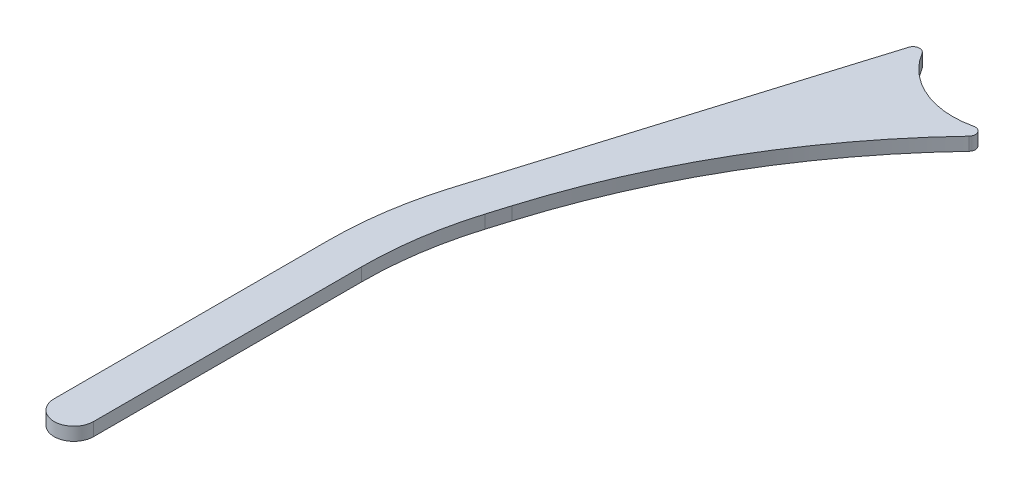
ISO-10303-21;
HEADER;
FILE_DESCRIPTION(('STEP AP214'),'2;1');
FILE_NAME('part.step','',(''),(''),'','','');
FILE_SCHEMA(('AUTOMOTIVE_DESIGN { 1 0 10303 214 1 1 1 1 }'));
ENDSEC;
DATA;
#1=APPLICATION_CONTEXT('core data for automotive mechanical design processes');
#2=APPLICATION_PROTOCOL_DEFINITION('international standard','automotive_design',2000,#1);
#3=PRODUCT_CONTEXT('',#1,'mechanical');
#4=PRODUCT('Part','Part','',(#3));
#5=PRODUCT_RELATED_PRODUCT_CATEGORY('part','',(#4));
#6=PRODUCT_DEFINITION_FORMATION('','',#4);
#7=PRODUCT_DEFINITION_CONTEXT('part definition',#1,'design');
#8=PRODUCT_DEFINITION('design','',#6,#7);
#9=PRODUCT_DEFINITION_SHAPE('','',#8);
#10=(LENGTH_UNIT() NAMED_UNIT(*) SI_UNIT(.MILLI.,.METRE.));
#11=(NAMED_UNIT(*) PLANE_ANGLE_UNIT() SI_UNIT($,.RADIAN.));
#12=(NAMED_UNIT(*) SI_UNIT($,.STERADIAN.) SOLID_ANGLE_UNIT());
#13=UNCERTAINTY_MEASURE_WITH_UNIT(LENGTH_MEASURE(1.E-05),#10,'distance_accuracy_value','');
#14=(GEOMETRIC_REPRESENTATION_CONTEXT(3) GLOBAL_UNCERTAINTY_ASSIGNED_CONTEXT((#13)) GLOBAL_UNIT_ASSIGNED_CONTEXT((#10,
#11,#12)) REPRESENTATION_CONTEXT('',''));
#15=CARTESIAN_POINT('',(0.,0.,0.));
#16=DIRECTION('',(0.,0.,1.));
#17=DIRECTION('',(1.,0.,0.));
#18=AXIS2_PLACEMENT_3D('',#15,#16,#17);
#19=CARTESIAN_POINT('',(-89.4955830872352,6.35,374.65));
#20=DIRECTION('',(0.,-1.,0.));
#21=DIRECTION('',(0.,0.,-1.));
#22=AXIS2_PLACEMENT_3D('',#19,#20,#21);
#23=CYLINDRICAL_SURFACE('',#22,9.52500000000001);
#24=CARTESIAN_POINT('',(-89.4955830872352,0.,374.65));
#25=DIRECTION('',(0.,1.,0.));
#26=DIRECTION('',(0.,0.,-1.));
#27=AXIS2_PLACEMENT_3D('',#24,#25,#26);
#28=CIRCLE('',#27,9.52500000000001);
#29=CARTESIAN_POINT('',(-99.0205830872352,0.,374.65));
#30=VERTEX_POINT('',#29);
#31=CARTESIAN_POINT('',(-79.9705830872352,0.,374.65));
#32=VERTEX_POINT('',#31);
#33=EDGE_CURVE('E146',#30,#32,#28,.T.);
#34=ORIENTED_EDGE('',*,*,#33,.T.);
#35=DIRECTION('',(0.,-1.,0.));
#36=VECTOR('',#35,1.);
#37=CARTESIAN_POINT('',(-79.9705830872352,6.35,374.65));
#38=LINE('',#37,#36);
#39=CARTESIAN_POINT('',(-79.9705830872352,6.35,374.65));
#40=VERTEX_POINT('',#39);
#41=EDGE_CURVE('E11',#40,#32,#38,.T.);
#42=ORIENTED_EDGE('',*,*,#41,.F.);
#43=CARTESIAN_POINT('',(-89.4955830872352,6.35,374.65));
#44=DIRECTION('',(0.,1.,0.));
#45=DIRECTION('',(0.,0.,-1.));
#46=AXIS2_PLACEMENT_3D('',#43,#44,#45);
#47=CIRCLE('',#46,9.52500000000001);
#48=CARTESIAN_POINT('',(-99.0205830872352,6.35,374.65));
#49=VERTEX_POINT('',#48);
#50=EDGE_CURVE('E166',#49,#40,#47,.T.);
#51=ORIENTED_EDGE('',*,*,#50,.F.);
#52=DIRECTION('',(0.,-1.,0.));
#53=VECTOR('',#52,1.);
#54=CARTESIAN_POINT('',(-99.0205830872352,6.35,374.65));
#55=LINE('',#54,#53);
#56=EDGE_CURVE('E142',#49,#30,#55,.T.);
#57=ORIENTED_EDGE('',*,*,#56,.T.);
#58=EDGE_LOOP('',(#34,#42,#51,#57));
#59=FACE_BOUND('',#58,.T.);
#60=ADVANCED_FACE('F32',(#59),#23,.T.);
#61=CARTESIAN_POINT('',(-79.9705830872352,6.35,245.266880287831));
#62=DIRECTION('',(-1.,0.,0.));
#63=DIRECTION('',(0.,0.,1.));
#64=AXIS2_PLACEMENT_3D('',#61,#62,#63);
#65=PLANE('',#64);
#66=DIRECTION('',(0.,0.,-1.));
#67=VECTOR('',#66,1.);
#68=CARTESIAN_POINT('',(-79.9705830872352,0.,245.266880287831));
#69=LINE('',#68,#67);
#70=CARTESIAN_POINT('',(-79.9705830872352,0.,245.266880287831));
#71=VERTEX_POINT('',#70);
#72=EDGE_CURVE('E149',#32,#71,#69,.T.);
#73=ORIENTED_EDGE('',*,*,#72,.T.);
#74=DIRECTION('',(0.,-1.,0.));
#75=VECTOR('',#74,1.);
#76=CARTESIAN_POINT('',(-79.9705830872352,6.35,245.266880287831));
#77=LINE('',#76,#75);
#78=CARTESIAN_POINT('',(-79.9705830872352,6.35,245.266880287831));
#79=VERTEX_POINT('',#78);
#80=EDGE_CURVE('E40',#79,#71,#77,.T.);
#81=ORIENTED_EDGE('',*,*,#80,.F.);
#82=DIRECTION('',(0.,0.,-1.));
#83=VECTOR('',#82,1.);
#84=CARTESIAN_POINT('',(-79.9705830872352,6.35,245.266880287831));
#85=LINE('',#84,#83);
#86=EDGE_CURVE('E100',#40,#79,#85,.T.);
#87=ORIENTED_EDGE('',*,*,#86,.F.);
#88=ORIENTED_EDGE('',*,*,#41,.T.);
#89=EDGE_LOOP('',(#73,#81,#87,#88));
#90=FACE_BOUND('',#89,.T.);
#91=ADVANCED_FACE('F238',(#90),#65,.F.);
#92=CARTESIAN_POINT('',(97.8294169127646,6.35,245.266880287832));
#93=DIRECTION('',(0.,-1.,0.));
#94=DIRECTION('',(0.,0.,-1.));
#95=AXIS2_PLACEMENT_3D('',#92,#93,#94);
#96=CYLINDRICAL_SURFACE('',#95,177.8);
#97=CARTESIAN_POINT('',(97.8294169127646,0.,245.266880287832));
#98=DIRECTION('',(0.,-1.,0.));
#99=DIRECTION('',(0.,0.,1.));
#100=AXIS2_PLACEMENT_3D('',#97,#98,#99);
#101=CIRCLE('',#100,177.8);
#102=CARTESIAN_POINT('',(-72.2428551354819,0.,193.418425341255));
#103=VERTEX_POINT('',#102);
#104=EDGE_CURVE('E151',#71,#103,#101,.T.);
#105=ORIENTED_EDGE('',*,*,#104,.T.);
#106=DIRECTION('',(0.,-1.,0.));
#107=VECTOR('',#106,1.);
#108=CARTESIAN_POINT('',(-72.2428551354819,6.35,193.418425341255));
#109=LINE('',#108,#107);
#110=CARTESIAN_POINT('',(-72.2428551354819,6.35,193.418425341255));
#111=VERTEX_POINT('',#110);
#112=EDGE_CURVE('E182',#111,#103,#109,.T.);
#113=ORIENTED_EDGE('',*,*,#112,.F.);
#114=CARTESIAN_POINT('',(97.8294169127646,6.35,245.266880287832));
#115=DIRECTION('',(0.,-1.,0.));
#116=DIRECTION('',(0.,0.,1.));
#117=AXIS2_PLACEMENT_3D('',#114,#115,#116);
#118=CIRCLE('',#117,177.8);
#119=EDGE_CURVE('E190',#79,#111,#118,.T.);
#120=ORIENTED_EDGE('',*,*,#119,.F.);
#121=ORIENTED_EDGE('',*,*,#80,.T.);
#122=EDGE_LOOP('',(#105,#113,#120,#121));
#123=FACE_BOUND('',#122,.T.);
#124=ADVANCED_FACE('F188',(#123),#96,.F.);
#125=CARTESIAN_POINT('',(-69.161727013274,6.35,183.311770075335));
#126=DIRECTION('',(-0.956536963150994,0.,-0.291611107686032));
#127=DIRECTION('',(-0.291611107686032,0.,0.956536963150994));
#128=AXIS2_PLACEMENT_3D('',#125,#126,#127);
#129=PLANE('',#128);
#130=DIRECTION('',(0.291611107686032,0.,-0.956536963150994));
#131=VECTOR('',#130,1.);
#132=CARTESIAN_POINT('',(-69.161727013274,0.,183.311770075335));
#133=LINE('',#132,#131);
#134=CARTESIAN_POINT('',(-69.161727013274,0.,183.311770075335));
#135=VERTEX_POINT('',#134);
#136=EDGE_CURVE('E153',#103,#135,#133,.T.);
#137=ORIENTED_EDGE('',*,*,#136,.T.);
#138=DIRECTION('',(0.,-1.,0.));
#139=VECTOR('',#138,1.);
#140=CARTESIAN_POINT('',(-69.161727013274,6.35,183.311770075335));
#141=LINE('',#140,#139);
#142=CARTESIAN_POINT('',(-69.161727013274,6.35,183.311770075335));
#143=VERTEX_POINT('',#142);
#144=EDGE_CURVE('E179',#143,#135,#141,.T.);
#145=ORIENTED_EDGE('',*,*,#144,.F.);
#146=DIRECTION('',(0.291611107686032,0.,-0.956536963150994));
#147=VECTOR('',#146,1.);
#148=CARTESIAN_POINT('',(-69.161727013274,6.35,183.311770075335));
#149=LINE('',#148,#147);
#150=EDGE_CURVE('E208',#111,#143,#149,.T.);
#151=ORIENTED_EDGE('',*,*,#150,.F.);
#152=ORIENTED_EDGE('',*,*,#112,.T.);
#153=EDGE_LOOP('',(#137,#145,#151,#152));
#154=FACE_BOUND('',#153,.T.);
#155=ADVANCED_FACE('F199',(#154),#129,.F.);
#156=CARTESIAN_POINT('',(266.906174547564,6.35,285.765869401558));
#157=DIRECTION('',(0.,-1.,0.));
#158=DIRECTION('',(0.,0.,-1.));
#159=AXIS2_PLACEMENT_3D('',#156,#157,#158);
#160=CYLINDRICAL_SURFACE('',#159,351.338123363026);
#161=CARTESIAN_POINT('',(266.906174547564,0.,285.765869401558));
#162=DIRECTION('',(0.,-1.,0.));
#163=DIRECTION('',(0.,0.,-1.));
#164=AXIS2_PLACEMENT_3D('',#161,#162,#163);
#165=CIRCLE('',#164,351.338123363026);
#166=CARTESIAN_POINT('',(12.0504296123994,0.,43.924958466714));
#167=VERTEX_POINT('',#166);
#168=EDGE_CURVE('E155',#135,#167,#165,.T.);
#169=ORIENTED_EDGE('',*,*,#168,.T.);
#170=DIRECTION('',(0.,-1.,0.));
#171=VECTOR('',#170,1.);
#172=CARTESIAN_POINT('',(12.0504296123994,6.35,43.924958466714));
#173=LINE('',#172,#171);
#174=CARTESIAN_POINT('',(12.0504296123994,6.35,43.924958466714));
#175=VERTEX_POINT('',#174);
#176=EDGE_CURVE('E176',#175,#167,#173,.T.);
#177=ORIENTED_EDGE('',*,*,#176,.F.);
#178=CARTESIAN_POINT('',(266.906174547564,6.35,285.765869401558));
#179=DIRECTION('',(0.,-1.,0.));
#180=DIRECTION('',(0.,0.,-1.));
#181=AXIS2_PLACEMENT_3D('',#178,#179,#180);
#182=CIRCLE('',#181,351.338123363026);
#183=EDGE_CURVE('E205',#143,#175,#182,.T.);
#184=ORIENTED_EDGE('',*,*,#183,.F.);
#185=ORIENTED_EDGE('',*,*,#144,.T.);
#186=EDGE_LOOP('',(#169,#177,#184,#185));
#187=FACE_BOUND('',#186,.T.);
#188=ADVANCED_FACE('F203',(#187),#160,.F.);
#189=CARTESIAN_POINT('',(9.74732916197356,6.35,41.7394714923194));
#190=DIRECTION('',(0.,-1.,0.));
#191=DIRECTION('',(0.,0.,-1.));
#192=AXIS2_PLACEMENT_3D('',#189,#190,#191);
#193=CYLINDRICAL_SURFACE('',#192,3.17499999999998);
#194=CARTESIAN_POINT('',(9.74732916197356,0.,41.7394714923194));
#195=DIRECTION('',(0.,1.,0.));
#196=DIRECTION('',(0.,0.,-1.));
#197=AXIS2_PLACEMENT_3D('',#194,#195,#196);
#198=CIRCLE('',#197,3.17499999999998);
#199=CARTESIAN_POINT('',(9.02530477960515,0.,38.6476587891846));
#200=VERTEX_POINT('',#199);
#201=EDGE_CURVE('E157',#167,#200,#198,.T.);
#202=ORIENTED_EDGE('',*,*,#201,.T.);
#203=DIRECTION('',(0.,-1.,0.));
#204=VECTOR('',#203,1.);
#205=CARTESIAN_POINT('',(9.02530477960515,6.35,38.6476587891846));
#206=LINE('',#205,#204);
#207=CARTESIAN_POINT('',(9.02530477960515,6.35,38.6476587891846));
#208=VERTEX_POINT('',#207);
#209=EDGE_CURVE('E173',#208,#200,#206,.T.);
#210=ORIENTED_EDGE('',*,*,#209,.F.);
#211=CARTESIAN_POINT('',(9.74732916197356,6.35,41.7394714923194));
#212=DIRECTION('',(0.,1.,0.));
#213=DIRECTION('',(0.,0.,-1.));
#214=AXIS2_PLACEMENT_3D('',#211,#212,#213);
#215=CIRCLE('',#214,3.17499999999998);
#216=EDGE_CURVE('E207',#175,#208,#215,.T.);
#217=ORIENTED_EDGE('',*,*,#216,.F.);
#218=ORIENTED_EDGE('',*,*,#176,.T.);
#219=EDGE_LOOP('',(#202,#210,#217,#218));
#220=FACE_BOUND('',#219,.T.);
#221=ADVANCED_FACE('F251',(#220),#193,.T.);
#222=CARTESIAN_POINT('',(0.,6.35,0.));
#223=DIRECTION('',(0.,-1.,0.));
#224=DIRECTION('',(0.,0.,-1.));
#225=AXIS2_PLACEMENT_3D('',#222,#223,#224);
#226=CYLINDRICAL_SURFACE('',#225,39.6875);
#227=CARTESIAN_POINT('',(0.,0.,0.));
#228=DIRECTION('',(0.,-1.,0.));
#229=DIRECTION('',(0.,0.,1.));
#230=AXIS2_PLACEMENT_3D('',#227,#228,#229);
#231=CIRCLE('',#230,39.6875);
#232=CARTESIAN_POINT('',(-33.934614128376,0.,20.5800782362028));
#233=VERTEX_POINT('',#232);
#234=EDGE_CURVE('E159',#200,#233,#231,.T.);
#235=ORIENTED_EDGE('',*,*,#234,.T.);
#236=DIRECTION('',(0.,-1.,0.));
#237=VECTOR('',#236,1.);
#238=CARTESIAN_POINT('',(-33.934614128376,6.35,20.5800782362028));
#239=LINE('',#238,#237);
#240=CARTESIAN_POINT('',(-33.934614128376,6.35,20.5800782362028));
#241=VERTEX_POINT('',#240);
#242=EDGE_CURVE('E170',#241,#233,#239,.T.);
#243=ORIENTED_EDGE('',*,*,#242,.F.);
#244=CARTESIAN_POINT('',(0.,6.35,0.));
#245=DIRECTION('',(0.,-1.,0.));
#246=DIRECTION('',(0.,0.,1.));
#247=AXIS2_PLACEMENT_3D('',#244,#245,#246);
#248=CIRCLE('',#247,39.6875);
#249=EDGE_CURVE('E210',#208,#241,#248,.T.);
#250=ORIENTED_EDGE('',*,*,#249,.F.);
#251=ORIENTED_EDGE('',*,*,#209,.T.);
#252=EDGE_LOOP('',(#235,#243,#250,#251));
#253=FACE_BOUND('',#252,.T.);
#254=ADVANCED_FACE('F219',(#253),#226,.F.);
#255=CARTESIAN_POINT('',(-36.649383258646,6.35,22.226484495099));
#256=DIRECTION('',(0.,-1.,0.));
#257=DIRECTION('',(0.,0.,-1.));
#258=AXIS2_PLACEMENT_3D('',#255,#256,#257);
#259=CYLINDRICAL_SURFACE('',#258,3.17499999999999);
#260=CARTESIAN_POINT('',(-36.649383258646,0.,22.226484495099));
#261=DIRECTION('',(0.,1.,0.));
#262=DIRECTION('',(0.,0.,-1.));
#263=AXIS2_PLACEMENT_3D('',#260,#261,#262);
#264=CIRCLE('',#263,3.17499999999999);
#265=CARTESIAN_POINT('',(-39.6863881166504,0.,21.3006192281958));
#266=VERTEX_POINT('',#265);
#267=EDGE_CURVE('E161',#233,#266,#264,.T.);
#268=ORIENTED_EDGE('',*,*,#267,.T.);
#269=DIRECTION('',(0.,-1.,0.));
#270=VECTOR('',#269,1.);
#271=CARTESIAN_POINT('',(-39.6863881166504,6.35,21.3006192281958));
#272=LINE('',#271,#270);
#273=CARTESIAN_POINT('',(-39.6863881166504,6.35,21.3006192281958));
#274=VERTEX_POINT('',#273);
#275=EDGE_CURVE('E137',#274,#266,#272,.T.);
#276=ORIENTED_EDGE('',*,*,#275,.F.);
#277=CARTESIAN_POINT('',(-36.649383258646,6.35,22.226484495099));
#278=DIRECTION('',(0.,1.,0.));
#279=DIRECTION('',(0.,0.,-1.));
#280=AXIS2_PLACEMENT_3D('',#277,#278,#279);
#281=CIRCLE('',#280,3.17499999999999);
#282=EDGE_CURVE('E128',#241,#274,#281,.T.);
#283=ORIENTED_EDGE('',*,*,#282,.F.);
#284=ORIENTED_EDGE('',*,*,#242,.T.);
#285=EDGE_LOOP('',(#268,#276,#283,#284));
#286=FACE_BOUND('',#285,.T.);
#287=ADVANCED_FACE('F223',(#286),#259,.T.);
#288=CARTESIAN_POINT('',(-91.292855135482,6.35,190.579127282469));
#289=DIRECTION('',(0.956536963150994,0.,0.29161110768603));
#290=DIRECTION('',(0.29161110768603,0.,-0.956536963150994));
#291=AXIS2_PLACEMENT_3D('',#288,#289,#290);
#292=PLANE('',#291);
#293=DIRECTION('',(-0.29161110768603,0.,0.956536963150994));
#294=VECTOR('',#293,1.);
#295=CARTESIAN_POINT('',(-91.292855135482,0.,190.579127282469));
#296=LINE('',#295,#294);
#297=CARTESIAN_POINT('',(-91.292855135482,0.,190.579127282469));
#298=VERTEX_POINT('',#297);
#299=EDGE_CURVE('E136',#266,#298,#296,.T.);
#300=ORIENTED_EDGE('',*,*,#299,.T.);
#301=DIRECTION('',(0.,-1.,0.));
#302=VECTOR('',#301,1.);
#303=CARTESIAN_POINT('',(-91.292855135482,6.35,190.579127282469));
#304=LINE('',#303,#302);
#305=CARTESIAN_POINT('',(-91.292855135482,6.35,190.579127282469));
#306=VERTEX_POINT('',#305);
#307=EDGE_CURVE('E133',#306,#298,#304,.T.);
#308=ORIENTED_EDGE('',*,*,#307,.F.);
#309=DIRECTION('',(-0.29161110768603,0.,0.956536963150994));
#310=VECTOR('',#309,1.);
#311=CARTESIAN_POINT('',(-91.292855135482,6.35,190.579127282469));
#312=LINE('',#311,#310);
#313=EDGE_CURVE('E122',#274,#306,#312,.T.);
#314=ORIENTED_EDGE('',*,*,#313,.F.);
#315=ORIENTED_EDGE('',*,*,#275,.T.);
#316=EDGE_LOOP('',(#300,#308,#314,#315));
#317=FACE_BOUND('',#316,.T.);
#318=ADVANCED_FACE('F134',(#317),#292,.F.);
#319=CARTESIAN_POINT('',(78.7794169127647,6.35,242.427582229045));
#320=DIRECTION('',(0.,-1.,0.));
#321=DIRECTION('',(0.,0.,-1.));
#322=AXIS2_PLACEMENT_3D('',#319,#320,#321);
#323=CYLINDRICAL_SURFACE('',#322,177.8);
#324=CARTESIAN_POINT('',(78.7794169127647,0.,242.427582229045));
#325=DIRECTION('',(0.,1.,0.));
#326=DIRECTION('',(0.,0.,1.));
#327=AXIS2_PLACEMENT_3D('',#324,#325,#326);
#328=CIRCLE('',#327,177.8);
#329=CARTESIAN_POINT('',(-99.0205830872353,0.,242.427582229045));
#330=VERTEX_POINT('',#329);
#331=EDGE_CURVE('E86',#298,#330,#328,.T.);
#332=ORIENTED_EDGE('',*,*,#331,.T.);
#333=DIRECTION('',(0.,-1.,0.));
#334=VECTOR('',#333,1.);
#335=CARTESIAN_POINT('',(-99.0205830872353,6.35,242.427582229045));
#336=LINE('',#335,#334);
#337=CARTESIAN_POINT('',(-99.0205830872353,6.35,242.427582229045));
#338=VERTEX_POINT('',#337);
#339=EDGE_CURVE('E138',#338,#330,#336,.T.);
#340=ORIENTED_EDGE('',*,*,#339,.F.);
#341=CARTESIAN_POINT('',(78.7794169127647,6.35,242.427582229045));
#342=DIRECTION('',(0.,1.,0.));
#343=DIRECTION('',(0.,0.,1.));
#344=AXIS2_PLACEMENT_3D('',#341,#342,#343);
#345=CIRCLE('',#344,177.8);
#346=EDGE_CURVE('E126',#306,#338,#345,.T.);
#347=ORIENTED_EDGE('',*,*,#346,.F.);
#348=ORIENTED_EDGE('',*,*,#307,.T.);
#349=EDGE_LOOP('',(#332,#340,#347,#348));
#350=FACE_BOUND('',#349,.T.);
#351=ADVANCED_FACE('F140',(#350),#323,.T.);
#352=CARTESIAN_POINT('',(-99.0205830872353,6.35,242.427582229045));
#353=DIRECTION('',(1.,0.,0.));
#354=DIRECTION('',(0.,0.,-1.));
#355=AXIS2_PLACEMENT_3D('',#352,#353,#354);
#356=PLANE('',#355);
#357=DIRECTION('',(0.,0.,1.));
#358=VECTOR('',#357,1.);
#359=CARTESIAN_POINT('',(-99.0205830872353,0.,242.427582229045));
#360=LINE('',#359,#358);
#361=EDGE_CURVE('E92',#330,#30,#360,.T.);
#362=ORIENTED_EDGE('',*,*,#361,.T.);
#363=ORIENTED_EDGE('',*,*,#56,.F.);
#364=DIRECTION('',(0.,0.,1.));
#365=VECTOR('',#364,1.);
#366=CARTESIAN_POINT('',(-99.0205830872353,6.35,242.427582229045));
#367=LINE('',#366,#365);
#368=EDGE_CURVE('E48',#338,#49,#367,.T.);
#369=ORIENTED_EDGE('',*,*,#368,.F.);
#370=ORIENTED_EDGE('',*,*,#339,.T.);
#371=EDGE_LOOP('',(#362,#363,#369,#370));
#372=FACE_BOUND('',#371,.T.);
#373=ADVANCED_FACE('F227',(#372),#356,.F.);
#374=CARTESIAN_POINT('',(-89.4955830872352,6.35,374.65));
#375=DIRECTION('',(0.,-1.,0.));
#376=DIRECTION('',(0.,0.,-1.));
#377=AXIS2_PLACEMENT_3D('',#374,#375,#376);
#378=PLANE('',#377);
#379=ORIENTED_EDGE('',*,*,#50,.T.);
#380=ORIENTED_EDGE('',*,*,#86,.T.);
#381=ORIENTED_EDGE('',*,*,#119,.T.);
#382=ORIENTED_EDGE('',*,*,#150,.T.);
#383=ORIENTED_EDGE('',*,*,#183,.T.);
#384=ORIENTED_EDGE('',*,*,#216,.T.);
#385=ORIENTED_EDGE('',*,*,#249,.T.);
#386=ORIENTED_EDGE('',*,*,#282,.T.);
#387=ORIENTED_EDGE('',*,*,#313,.T.);
#388=ORIENTED_EDGE('',*,*,#346,.T.);
#389=ORIENTED_EDGE('',*,*,#368,.T.);
#390=EDGE_LOOP('',(#379,#380,#381,#382,#383,#384,#385,#386,#387,#388,#389));
#391=FACE_BOUND('',#390,.T.);
#392=ADVANCED_FACE('F124',(#391),#378,.F.);
#393=CARTESIAN_POINT('',(-89.4955830872352,0.,374.65));
#394=DIRECTION('',(0.,-1.,0.));
#395=DIRECTION('',(0.,0.,-1.));
#396=AXIS2_PLACEMENT_3D('',#393,#394,#395);
#397=PLANE('',#396);
#398=ORIENTED_EDGE('',*,*,#33,.F.);
#399=ORIENTED_EDGE('',*,*,#361,.F.);
#400=ORIENTED_EDGE('',*,*,#331,.F.);
#401=ORIENTED_EDGE('',*,*,#299,.F.);
#402=ORIENTED_EDGE('',*,*,#267,.F.);
#403=ORIENTED_EDGE('',*,*,#234,.F.);
#404=ORIENTED_EDGE('',*,*,#201,.F.);
#405=ORIENTED_EDGE('',*,*,#168,.F.);
#406=ORIENTED_EDGE('',*,*,#136,.F.);
#407=ORIENTED_EDGE('',*,*,#104,.F.);
#408=ORIENTED_EDGE('',*,*,#72,.F.);
#409=EDGE_LOOP('',(#398,#399,#400,#401,#402,#403,#404,#405,#406,#407,#408));
#410=FACE_BOUND('',#409,.T.);
#411=ADVANCED_FACE('F194',(#410),#397,.T.);
#412=CLOSED_SHELL('',(#60,#91,#124,#155,#188,#221,#254,#287,#318,#351,#373,#392,#411));
#413=MANIFOLD_SOLID_BREP('B2',#412);
#414=ADVANCED_BREP_SHAPE_REPRESENTATION('',(#18,#413),#14);
#415=SHAPE_DEFINITION_REPRESENTATION(#9,#414);
ENDSEC;
END-ISO-10303-21;
